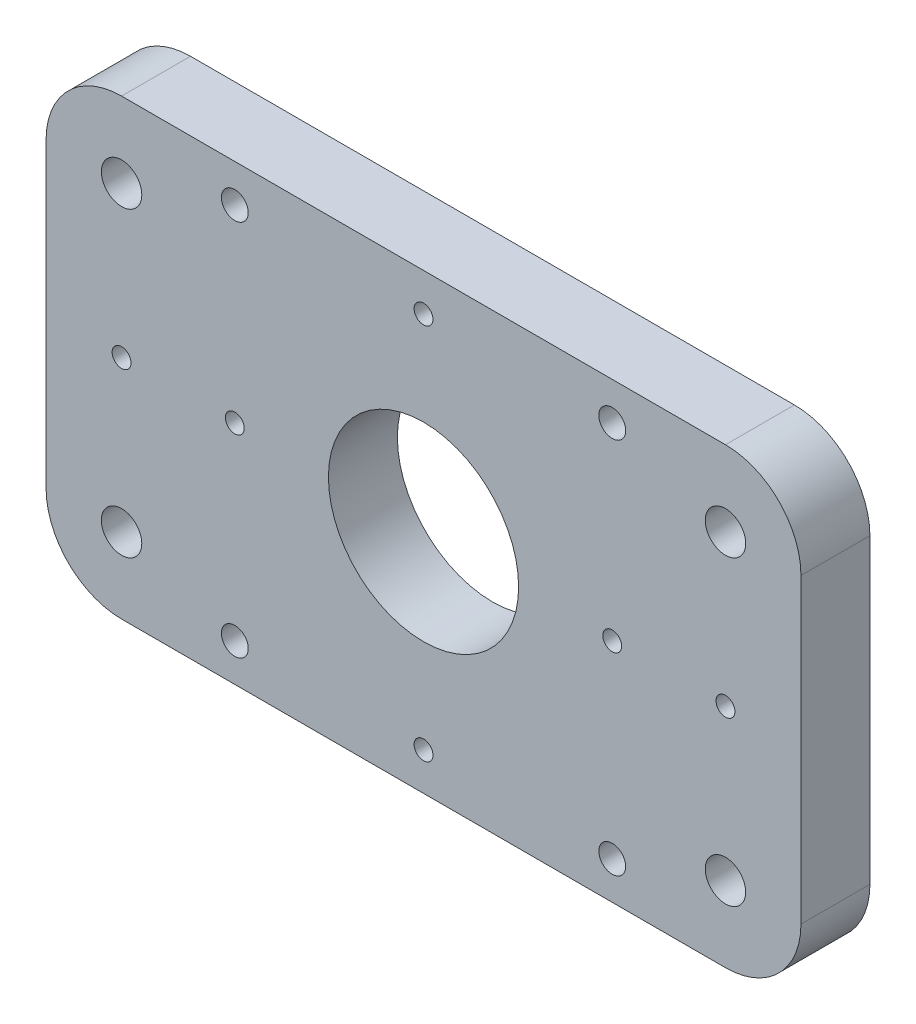
ISO-10303-21;
HEADER;
FILE_DESCRIPTION(('STEP AP214'),'2;1');
FILE_NAME('part.step','',(''),(''),'','','');
FILE_SCHEMA(('AUTOMOTIVE_DESIGN { 1 0 10303 214 1 1 1 1 }'));
ENDSEC;
DATA;
#1=APPLICATION_CONTEXT('core data for automotive mechanical design processes');
#2=APPLICATION_PROTOCOL_DEFINITION('international standard','automotive_design',2000,#1);
#3=PRODUCT_CONTEXT('',#1,'mechanical');
#4=PRODUCT('Part','Part','',(#3));
#5=PRODUCT_RELATED_PRODUCT_CATEGORY('part','',(#4));
#6=PRODUCT_DEFINITION_FORMATION('','',#4);
#7=PRODUCT_DEFINITION_CONTEXT('part definition',#1,'design');
#8=PRODUCT_DEFINITION('design','',#6,#7);
#9=PRODUCT_DEFINITION_SHAPE('','',#8);
#10=(LENGTH_UNIT() NAMED_UNIT(*) SI_UNIT(.MILLI.,.METRE.));
#11=(NAMED_UNIT(*) PLANE_ANGLE_UNIT() SI_UNIT($,.RADIAN.));
#12=(NAMED_UNIT(*) SI_UNIT($,.STERADIAN.) SOLID_ANGLE_UNIT());
#13=UNCERTAINTY_MEASURE_WITH_UNIT(LENGTH_MEASURE(1.E-05),#10,'distance_accuracy_value','');
#14=(GEOMETRIC_REPRESENTATION_CONTEXT(3) GLOBAL_UNCERTAINTY_ASSIGNED_CONTEXT((#13)) GLOBAL_UNIT_ASSIGNED_CONTEXT((#10,
#11,#12)) REPRESENTATION_CONTEXT('',''));
#15=CARTESIAN_POINT('',(0.,0.,0.));
#16=DIRECTION('',(0.,0.,1.));
#17=DIRECTION('',(1.,0.,0.));
#18=AXIS2_PLACEMENT_3D('',#15,#16,#17);
#19=CARTESIAN_POINT('',(0.,38.1,5.8));
#20=DIRECTION('',(0.,-1.,0.));
#21=DIRECTION('',(1.,0.,0.));
#22=AXIS2_PLACEMENT_3D('',#19,#20,#21);
#23=PLANE('',#22);
#24=DIRECTION('',(-1.,0.,0.));
#25=VECTOR('',#24,1.);
#26=CARTESIAN_POINT('',(0.,38.1,0.));
#27=LINE('',#26,#25);
#28=CARTESIAN_POINT('',(6.35,38.1,0.));
#29=VERTEX_POINT('',#28);
#30=CARTESIAN_POINT('',(-44.45,38.1,0.));
#31=VERTEX_POINT('',#30);
#32=EDGE_CURVE('E218',#29,#31,#27,.T.);
#33=ORIENTED_EDGE('',*,*,#32,.T.);
#34=DIRECTION('',(0.,0.,1.));
#35=VECTOR('',#34,1.);
#36=CARTESIAN_POINT('',(-44.45,38.1,5.8));
#37=LINE('',#36,#35);
#38=CARTESIAN_POINT('',(-44.45,38.1,5.8));
#39=VERTEX_POINT('',#38);
#40=EDGE_CURVE('E150',#31,#39,#37,.T.);
#41=ORIENTED_EDGE('',*,*,#40,.T.);
#42=DIRECTION('',(-1.,0.,0.));
#43=VECTOR('',#42,1.);
#44=CARTESIAN_POINT('',(0.,38.1,5.8));
#45=LINE('',#44,#43);
#46=CARTESIAN_POINT('',(6.35,38.1,5.8));
#47=VERTEX_POINT('',#46);
#48=EDGE_CURVE('E102',#47,#39,#45,.T.);
#49=ORIENTED_EDGE('',*,*,#48,.F.);
#50=DIRECTION('',(0.,0.,1.));
#51=VECTOR('',#50,1.);
#52=CARTESIAN_POINT('',(6.35,38.1,0.));
#53=LINE('',#52,#51);
#54=EDGE_CURVE('E148',#47,#29,#53,.F.);
#55=ORIENTED_EDGE('',*,*,#54,.T.);
#56=EDGE_LOOP('',(#33,#41,#49,#55));
#57=FACE_BOUND('',#56,.T.);
#58=ADVANCED_FACE('F32',(#57),#23,.F.);
#59=CARTESIAN_POINT('',(0.,0.,5.8));
#60=DIRECTION('',(0.,1.,0.));
#61=DIRECTION('',(-1.,0.,0.));
#62=AXIS2_PLACEMENT_3D('',#59,#60,#61);
#63=PLANE('',#62);
#64=DIRECTION('',(1.,0.,0.));
#65=VECTOR('',#64,1.);
#66=CARTESIAN_POINT('',(0.,0.,5.8));
#67=LINE('',#66,#65);
#68=CARTESIAN_POINT('',(-44.45,0.,5.8));
#69=VERTEX_POINT('',#68);
#70=CARTESIAN_POINT('',(6.35000000000001,0.,5.8));
#71=VERTEX_POINT('',#70);
#72=EDGE_CURVE('E124',#69,#71,#67,.T.);
#73=ORIENTED_EDGE('',*,*,#72,.F.);
#74=DIRECTION('',(0.,0.,1.));
#75=VECTOR('',#74,1.);
#76=CARTESIAN_POINT('',(-44.45,0.,0.));
#77=LINE('',#76,#75);
#78=CARTESIAN_POINT('',(-44.45,0.,0.));
#79=VERTEX_POINT('',#78);
#80=EDGE_CURVE('E140',#69,#79,#77,.F.);
#81=ORIENTED_EDGE('',*,*,#80,.T.);
#82=DIRECTION('',(1.,0.,0.));
#83=VECTOR('',#82,1.);
#84=CARTESIAN_POINT('',(0.,0.,0.));
#85=LINE('',#84,#83);
#86=CARTESIAN_POINT('',(6.35000000000001,0.,0.));
#87=VERTEX_POINT('',#86);
#88=EDGE_CURVE('E216',#79,#87,#85,.T.);
#89=ORIENTED_EDGE('',*,*,#88,.T.);
#90=DIRECTION('',(0.,0.,1.));
#91=VECTOR('',#90,1.);
#92=CARTESIAN_POINT('',(6.35000000000001,0.,5.8));
#93=LINE('',#92,#91);
#94=EDGE_CURVE('E137',#87,#71,#93,.T.);
#95=ORIENTED_EDGE('',*,*,#94,.T.);
#96=EDGE_LOOP('',(#73,#81,#89,#95));
#97=FACE_BOUND('',#96,.T.);
#98=ADVANCED_FACE('F225',(#97),#63,.F.);
#99=CARTESIAN_POINT('',(0.,38.1,5.8));
#100=DIRECTION('',(0.,0.,1.));
#101=DIRECTION('',(1.,0.,0.));
#102=AXIS2_PLACEMENT_3D('',#99,#100,#101);
#103=PLANE('',#102);
#104=CARTESIAN_POINT('',(-44.45,19.05,5.8));
#105=DIRECTION('',(0.,0.,-1.));
#106=DIRECTION('',(-1.,0.,0.));
#107=AXIS2_PLACEMENT_3D('',#104,#105,#106);
#108=CIRCLE('',#107,0.793749999999999);
#109=CARTESIAN_POINT('',(-45.24375,19.05,5.8));
#110=VERTEX_POINT('',#109);
#111=EDGE_CURVE('E567',#110,#110,#108,.T.);
#112=ORIENTED_EDGE('',*,*,#111,.T.);
#113=EDGE_LOOP('',(#112));
#114=FACE_BOUND('',#113,.T.);
#115=CARTESIAN_POINT('',(6.35000000000001,19.05,5.8));
#116=DIRECTION('',(0.,0.,-1.));
#117=DIRECTION('',(-1.,0.,0.));
#118=AXIS2_PLACEMENT_3D('',#115,#116,#117);
#119=CIRCLE('',#118,0.79375);
#120=CARTESIAN_POINT('',(5.55625000000001,19.05,5.8));
#121=VERTEX_POINT('',#120);
#122=EDGE_CURVE('E563',#121,#121,#119,.T.);
#123=ORIENTED_EDGE('',*,*,#122,.T.);
#124=EDGE_LOOP('',(#123));
#125=FACE_BOUND('',#124,.T.);
#126=CARTESIAN_POINT('',(6.35000000000001,31.75,5.8));
#127=DIRECTION('',(0.,0.,1.));
#128=DIRECTION('',(1.,0.,0.));
#129=AXIS2_PLACEMENT_3D('',#126,#127,#128);
#130=CIRCLE('',#129,1.7);
#131=CARTESIAN_POINT('',(8.05000000000001,31.75,5.8));
#132=VERTEX_POINT('',#131);
#133=EDGE_CURVE('E557',#132,#132,#130,.T.);
#134=ORIENTED_EDGE('',*,*,#133,.F.);
#135=EDGE_LOOP('',(#134));
#136=FACE_BOUND('',#135,.T.);
#137=CARTESIAN_POINT('',(-44.45,31.75,5.8));
#138=DIRECTION('',(0.,0.,1.));
#139=DIRECTION('',(1.,0.,0.));
#140=AXIS2_PLACEMENT_3D('',#137,#138,#139);
#141=CIRCLE('',#140,1.7);
#142=CARTESIAN_POINT('',(-42.75,31.75,5.8));
#143=VERTEX_POINT('',#142);
#144=EDGE_CURVE('E551',#143,#143,#141,.T.);
#145=ORIENTED_EDGE('',*,*,#144,.F.);
#146=EDGE_LOOP('',(#145));
#147=FACE_BOUND('',#146,.T.);
#148=CARTESIAN_POINT('',(-44.45,6.35000000000001,5.8));
#149=DIRECTION('',(0.,0.,1.));
#150=DIRECTION('',(1.,0.,0.));
#151=AXIS2_PLACEMENT_3D('',#148,#149,#150);
#152=CIRCLE('',#151,1.7);
#153=CARTESIAN_POINT('',(-42.75,6.35000000000001,5.8));
#154=VERTEX_POINT('',#153);
#155=EDGE_CURVE('E543',#154,#154,#152,.T.);
#156=ORIENTED_EDGE('',*,*,#155,.F.);
#157=EDGE_LOOP('',(#156));
#158=FACE_BOUND('',#157,.T.);
#159=CARTESIAN_POINT('',(6.35000000000001,6.35,5.8));
#160=DIRECTION('',(0.,0.,1.));
#161=DIRECTION('',(1.,0.,0.));
#162=AXIS2_PLACEMENT_3D('',#159,#160,#161);
#163=CIRCLE('',#162,1.7);
#164=CARTESIAN_POINT('',(8.05000000000001,6.35,5.8));
#165=VERTEX_POINT('',#164);
#166=EDGE_CURVE('E157',#165,#165,#163,.T.);
#167=ORIENTED_EDGE('',*,*,#166,.F.);
#168=EDGE_LOOP('',(#167));
#169=FACE_BOUND('',#168,.T.);
#170=CARTESIAN_POINT('',(-19.05,3.17499999999996,5.8));
#171=DIRECTION('',(0.,0.,1.));
#172=DIRECTION('',(1.,0.,0.));
#173=AXIS2_PLACEMENT_3D('',#170,#171,#172);
#174=CIRCLE('',#173,0.793749999999999);
#175=CARTESIAN_POINT('',(-18.25625,3.17499999999996,5.8));
#176=VERTEX_POINT('',#175);
#177=EDGE_CURVE('E164',#176,#176,#174,.T.);
#178=ORIENTED_EDGE('',*,*,#177,.F.);
#179=EDGE_LOOP('',(#178));
#180=FACE_BOUND('',#179,.T.);
#181=CARTESIAN_POINT('',(-3.17499999999995,19.05,5.8));
#182=DIRECTION('',(0.,0.,1.));
#183=DIRECTION('',(1.,0.,0.));
#184=AXIS2_PLACEMENT_3D('',#181,#182,#183);
#185=CIRCLE('',#184,0.79375);
#186=CARTESIAN_POINT('',(-2.38124999999995,19.05,5.8));
#187=VERTEX_POINT('',#186);
#188=EDGE_CURVE('E169',#187,#187,#185,.T.);
#189=ORIENTED_EDGE('',*,*,#188,.F.);
#190=EDGE_LOOP('',(#189));
#191=FACE_BOUND('',#190,.T.);
#192=CARTESIAN_POINT('',(-19.05,34.925,5.8));
#193=DIRECTION('',(0.,0.,1.));
#194=DIRECTION('',(1.,0.,0.));
#195=AXIS2_PLACEMENT_3D('',#192,#193,#194);
#196=CIRCLE('',#195,0.793749999999999);
#197=CARTESIAN_POINT('',(-18.25625,34.925,5.8));
#198=VERTEX_POINT('',#197);
#199=EDGE_CURVE('E175',#198,#198,#196,.T.);
#200=ORIENTED_EDGE('',*,*,#199,.F.);
#201=EDGE_LOOP('',(#200));
#202=FACE_BOUND('',#201,.T.);
#203=CARTESIAN_POINT('',(-34.925,19.05,5.8));
#204=DIRECTION('',(0.,0.,1.));
#205=DIRECTION('',(1.,0.,0.));
#206=AXIS2_PLACEMENT_3D('',#203,#204,#205);
#207=CIRCLE('',#206,0.793749999999999);
#208=CARTESIAN_POINT('',(-34.13125,19.05,5.8));
#209=VERTEX_POINT('',#208);
#210=EDGE_CURVE('E181',#209,#209,#207,.T.);
#211=ORIENTED_EDGE('',*,*,#210,.F.);
#212=EDGE_LOOP('',(#211));
#213=FACE_BOUND('',#212,.T.);
#214=CARTESIAN_POINT('',(-34.925,3.17499999999997,5.8));
#215=DIRECTION('',(0.,0.,1.));
#216=DIRECTION('',(1.,0.,0.));
#217=AXIS2_PLACEMENT_3D('',#214,#215,#216);
#218=CIRCLE('',#217,1.13);
#219=CARTESIAN_POINT('',(-33.795,3.17499999999997,5.8));
#220=VERTEX_POINT('',#219);
#221=EDGE_CURVE('E187',#220,#220,#218,.T.);
#222=ORIENTED_EDGE('',*,*,#221,.F.);
#223=EDGE_LOOP('',(#222));
#224=FACE_BOUND('',#223,.T.);
#225=CARTESIAN_POINT('',(-3.17499999999997,3.17499999999997,5.8));
#226=DIRECTION('',(0.,0.,1.));
#227=DIRECTION('',(1.,0.,0.));
#228=AXIS2_PLACEMENT_3D('',#225,#226,#227);
#229=CIRCLE('',#228,1.13);
#230=CARTESIAN_POINT('',(-2.04499999999997,3.17499999999997,5.8));
#231=VERTEX_POINT('',#230);
#232=EDGE_CURVE('E193',#231,#231,#229,.T.);
#233=ORIENTED_EDGE('',*,*,#232,.F.);
#234=EDGE_LOOP('',(#233));
#235=FACE_BOUND('',#234,.T.);
#236=CARTESIAN_POINT('',(-3.17499999999997,34.925,5.8));
#237=DIRECTION('',(0.,0.,1.));
#238=DIRECTION('',(1.,0.,0.));
#239=AXIS2_PLACEMENT_3D('',#236,#237,#238);
#240=CIRCLE('',#239,1.13);
#241=CARTESIAN_POINT('',(-2.04499999999997,34.925,5.8));
#242=VERTEX_POINT('',#241);
#243=EDGE_CURVE('E199',#242,#242,#240,.T.);
#244=ORIENTED_EDGE('',*,*,#243,.F.);
#245=EDGE_LOOP('',(#244));
#246=FACE_BOUND('',#245,.T.);
#247=CARTESIAN_POINT('',(-34.925,34.925,5.8));
#248=DIRECTION('',(0.,0.,1.));
#249=DIRECTION('',(1.,0.,0.));
#250=AXIS2_PLACEMENT_3D('',#247,#248,#249);
#251=CIRCLE('',#250,1.13);
#252=CARTESIAN_POINT('',(-33.795,34.925,5.8));
#253=VERTEX_POINT('',#252);
#254=EDGE_CURVE('E205',#253,#253,#251,.T.);
#255=ORIENTED_EDGE('',*,*,#254,.F.);
#256=EDGE_LOOP('',(#255));
#257=FACE_BOUND('',#256,.T.);
#258=CARTESIAN_POINT('',(-19.05,19.05,5.8));
#259=DIRECTION('',(0.,0.,1.));
#260=DIRECTION('',(1.,0.,0.));
#261=AXIS2_PLACEMENT_3D('',#258,#259,#260);
#262=CIRCLE('',#261,8.);
#263=CARTESIAN_POINT('',(-11.05,19.05,5.8));
#264=VERTEX_POINT('',#263);
#265=EDGE_CURVE('E211',#264,#264,#262,.T.);
#266=ORIENTED_EDGE('',*,*,#265,.F.);
#267=EDGE_LOOP('',(#266));
#268=FACE_BOUND('',#267,.T.);
#269=DIRECTION('',(0.,-1.,0.));
#270=VECTOR('',#269,1.);
#271=CARTESIAN_POINT('',(-50.8,38.1,5.8));
#272=LINE('',#271,#270);
#273=CARTESIAN_POINT('',(-50.8,31.75,5.8));
#274=VERTEX_POINT('',#273);
#275=CARTESIAN_POINT('',(-50.8,6.34999999999999,5.8));
#276=VERTEX_POINT('',#275);
#277=EDGE_CURVE('E100',#274,#276,#272,.T.);
#278=ORIENTED_EDGE('',*,*,#277,.T.);
#279=CARTESIAN_POINT('',(-44.45,6.34999999999999,5.8));
#280=DIRECTION('',(0.,0.,1.));
#281=DIRECTION('',(1.,0.,0.));
#282=AXIS2_PLACEMENT_3D('',#279,#280,#281);
#283=CIRCLE('',#282,6.35);
#284=EDGE_CURVE('E107',#276,#69,#283,.T.);
#285=ORIENTED_EDGE('',*,*,#284,.T.);
#286=ORIENTED_EDGE('',*,*,#72,.T.);
#287=CARTESIAN_POINT('',(6.35000000000001,6.35,5.8));
#288=DIRECTION('',(0.,0.,1.));
#289=DIRECTION('',(1.,0.,0.));
#290=AXIS2_PLACEMENT_3D('',#287,#288,#289);
#291=CIRCLE('',#290,6.35);
#292=CARTESIAN_POINT('',(12.7,6.35,5.8));
#293=VERTEX_POINT('',#292);
#294=EDGE_CURVE('E108',#71,#293,#291,.T.);
#295=ORIENTED_EDGE('',*,*,#294,.T.);
#296=DIRECTION('',(0.,1.,0.));
#297=VECTOR('',#296,1.);
#298=CARTESIAN_POINT('',(12.7,38.1,5.8));
#299=LINE('',#298,#297);
#300=CARTESIAN_POINT('',(12.7,31.75,5.8));
#301=VERTEX_POINT('',#300);
#302=EDGE_CURVE('E155',#293,#301,#299,.T.);
#303=ORIENTED_EDGE('',*,*,#302,.T.);
#304=CARTESIAN_POINT('',(6.35000000000001,31.75,5.8));
#305=DIRECTION('',(0.,0.,1.));
#306=DIRECTION('',(1.,0.,0.));
#307=AXIS2_PLACEMENT_3D('',#304,#305,#306);
#308=CIRCLE('',#307,6.35);
#309=EDGE_CURVE('E126',#301,#47,#308,.T.);
#310=ORIENTED_EDGE('',*,*,#309,.T.);
#311=ORIENTED_EDGE('',*,*,#48,.T.);
#312=CARTESIAN_POINT('',(-44.45,31.75,5.8));
#313=DIRECTION('',(0.,0.,1.));
#314=DIRECTION('',(1.,0.,0.));
#315=AXIS2_PLACEMENT_3D('',#312,#313,#314);
#316=CIRCLE('',#315,6.35);
#317=EDGE_CURVE('E97',#39,#274,#316,.T.);
#318=ORIENTED_EDGE('',*,*,#317,.T.);
#319=EDGE_LOOP('',(#278,#285,#286,#295,#303,#310,#311,#318));
#320=FACE_BOUND('',#319,.T.);
#321=ADVANCED_FACE('F99',(#114,#125,#136,#147,#158,#169,#180,#191,#202,#213,#224,#235,#246,#257,
#268,#320),#103,.T.);
#322=CARTESIAN_POINT('',(0.,38.1,0.));
#323=DIRECTION('',(0.,0.,1.));
#324=DIRECTION('',(1.,0.,0.));
#325=AXIS2_PLACEMENT_3D('',#322,#323,#324);
#326=PLANE('',#325);
#327=CARTESIAN_POINT('',(-44.45,19.05,0.));
#328=DIRECTION('',(0.,0.,-1.));
#329=DIRECTION('',(-1.,0.,0.));
#330=AXIS2_PLACEMENT_3D('',#327,#328,#329);
#331=CIRCLE('',#330,0.793749999999999);
#332=CARTESIAN_POINT('',(-45.24375,19.05,0.));
#333=VERTEX_POINT('',#332);
#334=EDGE_CURVE('E570',#333,#333,#331,.T.);
#335=ORIENTED_EDGE('',*,*,#334,.F.);
#336=EDGE_LOOP('',(#335));
#337=FACE_BOUND('',#336,.T.);
#338=CARTESIAN_POINT('',(6.35000000000001,19.05,0.));
#339=DIRECTION('',(0.,0.,-1.));
#340=DIRECTION('',(-1.,0.,0.));
#341=AXIS2_PLACEMENT_3D('',#338,#339,#340);
#342=CIRCLE('',#341,0.79375);
#343=CARTESIAN_POINT('',(5.55625000000001,19.05,0.));
#344=VERTEX_POINT('',#343);
#345=EDGE_CURVE('E564',#344,#344,#342,.T.);
#346=ORIENTED_EDGE('',*,*,#345,.F.);
#347=EDGE_LOOP('',(#346));
#348=FACE_BOUND('',#347,.T.);
#349=CARTESIAN_POINT('',(6.35000000000001,31.75,0.));
#350=DIRECTION('',(0.,0.,-1.));
#351=DIRECTION('',(-1.,0.,0.));
#352=AXIS2_PLACEMENT_3D('',#349,#350,#351);
#353=CIRCLE('',#352,1.7);
#354=CARTESIAN_POINT('',(4.65000000000001,31.75,0.));
#355=VERTEX_POINT('',#354);
#356=EDGE_CURVE('E560',#355,#355,#353,.T.);
#357=ORIENTED_EDGE('',*,*,#356,.F.);
#358=EDGE_LOOP('',(#357));
#359=FACE_BOUND('',#358,.T.);
#360=CARTESIAN_POINT('',(-44.45,31.75,0.));
#361=DIRECTION('',(0.,0.,-1.));
#362=DIRECTION('',(-1.,0.,0.));
#363=AXIS2_PLACEMENT_3D('',#360,#361,#362);
#364=CIRCLE('',#363,1.7);
#365=CARTESIAN_POINT('',(-46.15,31.75,0.));
#366=VERTEX_POINT('',#365);
#367=EDGE_CURVE('E554',#366,#366,#364,.T.);
#368=ORIENTED_EDGE('',*,*,#367,.F.);
#369=EDGE_LOOP('',(#368));
#370=FACE_BOUND('',#369,.T.);
#371=CARTESIAN_POINT('',(-44.45,6.35000000000001,0.));
#372=DIRECTION('',(0.,0.,-1.));
#373=DIRECTION('',(-1.,0.,0.));
#374=AXIS2_PLACEMENT_3D('',#371,#372,#373);
#375=CIRCLE('',#374,1.7);
#376=CARTESIAN_POINT('',(-46.15,6.35000000000001,0.));
#377=VERTEX_POINT('',#376);
#378=EDGE_CURVE('E546',#377,#377,#375,.T.);
#379=ORIENTED_EDGE('',*,*,#378,.F.);
#380=EDGE_LOOP('',(#379));
#381=FACE_BOUND('',#380,.T.);
#382=CARTESIAN_POINT('',(6.35000000000001,6.35,0.));
#383=DIRECTION('',(0.,0.,-1.));
#384=DIRECTION('',(-1.,0.,0.));
#385=AXIS2_PLACEMENT_3D('',#382,#383,#384);
#386=CIRCLE('',#385,1.7);
#387=CARTESIAN_POINT('',(4.65000000000002,6.35,0.));
#388=VERTEX_POINT('',#387);
#389=EDGE_CURVE('E161',#388,#388,#386,.T.);
#390=ORIENTED_EDGE('',*,*,#389,.F.);
#391=EDGE_LOOP('',(#390));
#392=FACE_BOUND('',#391,.T.);
#393=CARTESIAN_POINT('',(-19.05,3.17499999999996,0.));
#394=DIRECTION('',(0.,0.,1.));
#395=DIRECTION('',(1.,0.,0.));
#396=AXIS2_PLACEMENT_3D('',#393,#394,#395);
#397=CIRCLE('',#396,0.793749999999999);
#398=CARTESIAN_POINT('',(-18.25625,3.17499999999996,0.));
#399=VERTEX_POINT('',#398);
#400=EDGE_CURVE('E166',#399,#399,#397,.T.);
#401=ORIENTED_EDGE('',*,*,#400,.T.);
#402=EDGE_LOOP('',(#401));
#403=FACE_BOUND('',#402,.T.);
#404=CARTESIAN_POINT('',(-3.17499999999995,19.05,0.));
#405=DIRECTION('',(0.,0.,1.));
#406=DIRECTION('',(1.,0.,0.));
#407=AXIS2_PLACEMENT_3D('',#404,#405,#406);
#408=CIRCLE('',#407,0.79375);
#409=CARTESIAN_POINT('',(-2.38124999999995,19.05,0.));
#410=VERTEX_POINT('',#409);
#411=EDGE_CURVE('E172',#410,#410,#408,.T.);
#412=ORIENTED_EDGE('',*,*,#411,.T.);
#413=EDGE_LOOP('',(#412));
#414=FACE_BOUND('',#413,.T.);
#415=CARTESIAN_POINT('',(-19.05,34.925,0.));
#416=DIRECTION('',(0.,0.,1.));
#417=DIRECTION('',(1.,0.,0.));
#418=AXIS2_PLACEMENT_3D('',#415,#416,#417);
#419=CIRCLE('',#418,0.793749999999999);
#420=CARTESIAN_POINT('',(-18.25625,34.925,0.));
#421=VERTEX_POINT('',#420);
#422=EDGE_CURVE('E178',#421,#421,#419,.T.);
#423=ORIENTED_EDGE('',*,*,#422,.T.);
#424=EDGE_LOOP('',(#423));
#425=FACE_BOUND('',#424,.T.);
#426=CARTESIAN_POINT('',(-34.925,19.05,0.));
#427=DIRECTION('',(0.,0.,1.));
#428=DIRECTION('',(1.,0.,0.));
#429=AXIS2_PLACEMENT_3D('',#426,#427,#428);
#430=CIRCLE('',#429,0.793749999999999);
#431=CARTESIAN_POINT('',(-34.13125,19.05,0.));
#432=VERTEX_POINT('',#431);
#433=EDGE_CURVE('E184',#432,#432,#430,.T.);
#434=ORIENTED_EDGE('',*,*,#433,.T.);
#435=EDGE_LOOP('',(#434));
#436=FACE_BOUND('',#435,.T.);
#437=CARTESIAN_POINT('',(-34.925,3.17499999999997,0.));
#438=DIRECTION('',(0.,0.,1.));
#439=DIRECTION('',(1.,0.,0.));
#440=AXIS2_PLACEMENT_3D('',#437,#438,#439);
#441=CIRCLE('',#440,1.13);
#442=CARTESIAN_POINT('',(-33.795,3.17499999999997,0.));
#443=VERTEX_POINT('',#442);
#444=EDGE_CURVE('E190',#443,#443,#441,.T.);
#445=ORIENTED_EDGE('',*,*,#444,.T.);
#446=EDGE_LOOP('',(#445));
#447=FACE_BOUND('',#446,.T.);
#448=CARTESIAN_POINT('',(-3.17499999999997,3.17499999999997,0.));
#449=DIRECTION('',(0.,0.,1.));
#450=DIRECTION('',(1.,0.,0.));
#451=AXIS2_PLACEMENT_3D('',#448,#449,#450);
#452=CIRCLE('',#451,1.13);
#453=CARTESIAN_POINT('',(-2.04499999999997,3.17499999999997,0.));
#454=VERTEX_POINT('',#453);
#455=EDGE_CURVE('E196',#454,#454,#452,.T.);
#456=ORIENTED_EDGE('',*,*,#455,.T.);
#457=EDGE_LOOP('',(#456));
#458=FACE_BOUND('',#457,.T.);
#459=CARTESIAN_POINT('',(-3.17499999999997,34.925,0.));
#460=DIRECTION('',(0.,0.,1.));
#461=DIRECTION('',(1.,0.,0.));
#462=AXIS2_PLACEMENT_3D('',#459,#460,#461);
#463=CIRCLE('',#462,1.13);
#464=CARTESIAN_POINT('',(-2.04499999999997,34.925,0.));
#465=VERTEX_POINT('',#464);
#466=EDGE_CURVE('E202',#465,#465,#463,.T.);
#467=ORIENTED_EDGE('',*,*,#466,.T.);
#468=EDGE_LOOP('',(#467));
#469=FACE_BOUND('',#468,.T.);
#470=CARTESIAN_POINT('',(-34.925,34.925,0.));
#471=DIRECTION('',(0.,0.,1.));
#472=DIRECTION('',(1.,0.,0.));
#473=AXIS2_PLACEMENT_3D('',#470,#471,#472);
#474=CIRCLE('',#473,1.13);
#475=CARTESIAN_POINT('',(-33.795,34.925,0.));
#476=VERTEX_POINT('',#475);
#477=EDGE_CURVE('E208',#476,#476,#474,.T.);
#478=ORIENTED_EDGE('',*,*,#477,.T.);
#479=EDGE_LOOP('',(#478));
#480=FACE_BOUND('',#479,.T.);
#481=CARTESIAN_POINT('',(-19.05,19.05,0.));
#482=DIRECTION('',(0.,0.,1.));
#483=DIRECTION('',(1.,0.,0.));
#484=AXIS2_PLACEMENT_3D('',#481,#482,#483);
#485=CIRCLE('',#484,8.);
#486=CARTESIAN_POINT('',(-11.05,19.05,0.));
#487=VERTEX_POINT('',#486);
#488=EDGE_CURVE('E131',#487,#487,#485,.T.);
#489=ORIENTED_EDGE('',*,*,#488,.T.);
#490=EDGE_LOOP('',(#489));
#491=FACE_BOUND('',#490,.T.);
#492=ORIENTED_EDGE('',*,*,#88,.F.);
#493=CARTESIAN_POINT('',(-44.45,6.34999999999999,0.));
#494=DIRECTION('',(0.,0.,1.));
#495=DIRECTION('',(1.,0.,0.));
#496=AXIS2_PLACEMENT_3D('',#493,#494,#495);
#497=CIRCLE('',#496,6.35);
#498=CARTESIAN_POINT('',(-50.8,6.34999999999999,0.));
#499=VERTEX_POINT('',#498);
#500=EDGE_CURVE('E146',#79,#499,#497,.F.);
#501=ORIENTED_EDGE('',*,*,#500,.T.);
#502=DIRECTION('',(0.,-1.,0.));
#503=VECTOR('',#502,1.);
#504=CARTESIAN_POINT('',(-50.8,38.1,0.));
#505=LINE('',#504,#503);
#506=CARTESIAN_POINT('',(-50.8,31.75,0.));
#507=VERTEX_POINT('',#506);
#508=EDGE_CURVE('E118',#507,#499,#505,.T.);
#509=ORIENTED_EDGE('',*,*,#508,.F.);
#510=CARTESIAN_POINT('',(-44.45,31.75,0.));
#511=DIRECTION('',(0.,0.,1.));
#512=DIRECTION('',(1.,0.,0.));
#513=AXIS2_PLACEMENT_3D('',#510,#511,#512);
#514=CIRCLE('',#513,6.35);
#515=EDGE_CURVE('E123',#507,#31,#514,.F.);
#516=ORIENTED_EDGE('',*,*,#515,.T.);
#517=ORIENTED_EDGE('',*,*,#32,.F.);
#518=CARTESIAN_POINT('',(6.35000000000001,31.75,0.));
#519=DIRECTION('',(0.,0.,1.));
#520=DIRECTION('',(1.,0.,0.));
#521=AXIS2_PLACEMENT_3D('',#518,#519,#520);
#522=CIRCLE('',#521,6.35);
#523=CARTESIAN_POINT('',(12.7,31.75,0.));
#524=VERTEX_POINT('',#523);
#525=EDGE_CURVE('E47',#29,#524,#522,.F.);
#526=ORIENTED_EDGE('',*,*,#525,.T.);
#527=DIRECTION('',(0.,1.,0.));
#528=VECTOR('',#527,1.);
#529=CARTESIAN_POINT('',(12.7,38.1,0.));
#530=LINE('',#529,#528);
#531=CARTESIAN_POINT('',(12.7,6.35,0.));
#532=VERTEX_POINT('',#531);
#533=EDGE_CURVE('E119',#532,#524,#530,.T.);
#534=ORIENTED_EDGE('',*,*,#533,.F.);
#535=CARTESIAN_POINT('',(6.35000000000001,6.35,0.));
#536=DIRECTION('',(0.,0.,1.));
#537=DIRECTION('',(1.,0.,0.));
#538=AXIS2_PLACEMENT_3D('',#535,#536,#537);
#539=CIRCLE('',#538,6.35);
#540=EDGE_CURVE('E143',#532,#87,#539,.F.);
#541=ORIENTED_EDGE('',*,*,#540,.T.);
#542=EDGE_LOOP('',(#492,#501,#509,#516,#517,#526,#534,#541));
#543=FACE_BOUND('',#542,.T.);
#544=ADVANCED_FACE('F231',(#337,#348,#359,#370,#381,#392,#403,#414,#425,#436,#447,#458,#469,
#480,#491,#543),#326,.F.);
#545=CARTESIAN_POINT('',(-19.05,19.05,-6.9));
#546=DIRECTION('',(0.,0.,1.));
#547=DIRECTION('',(1.,0.,0.));
#548=AXIS2_PLACEMENT_3D('',#545,#546,#547);
#549=CYLINDRICAL_SURFACE('',#548,8.);
#550=ORIENTED_EDGE('',*,*,#265,.T.);
#551=EDGE_LOOP('',(#550));
#552=FACE_BOUND('',#551,.T.);
#553=ORIENTED_EDGE('',*,*,#488,.F.);
#554=EDGE_LOOP('',(#553));
#555=FACE_BOUND('',#554,.T.);
#556=ADVANCED_FACE('F233',(#552,#555),#549,.F.);
#557=CARTESIAN_POINT('',(-34.925,34.925,0.));
#558=DIRECTION('',(0.,0.,1.));
#559=DIRECTION('',(1.,0.,0.));
#560=AXIS2_PLACEMENT_3D('',#557,#558,#559);
#561=CYLINDRICAL_SURFACE('',#560,1.13);
#562=ORIENTED_EDGE('',*,*,#477,.F.);
#563=EDGE_LOOP('',(#562));
#564=FACE_BOUND('',#563,.T.);
#565=ORIENTED_EDGE('',*,*,#254,.T.);
#566=EDGE_LOOP('',(#565));
#567=FACE_BOUND('',#566,.T.);
#568=ADVANCED_FACE('F240',(#564,#567),#561,.F.);
#569=CARTESIAN_POINT('',(-3.17499999999997,34.925,0.));
#570=DIRECTION('',(0.,0.,1.));
#571=DIRECTION('',(1.,0.,0.));
#572=AXIS2_PLACEMENT_3D('',#569,#570,#571);
#573=CYLINDRICAL_SURFACE('',#572,1.13);
#574=ORIENTED_EDGE('',*,*,#466,.F.);
#575=EDGE_LOOP('',(#574));
#576=FACE_BOUND('',#575,.T.);
#577=ORIENTED_EDGE('',*,*,#243,.T.);
#578=EDGE_LOOP('',(#577));
#579=FACE_BOUND('',#578,.T.);
#580=ADVANCED_FACE('F443',(#576,#579),#573,.F.);
#581=CARTESIAN_POINT('',(-3.17499999999997,3.17499999999997,0.));
#582=DIRECTION('',(0.,0.,1.));
#583=DIRECTION('',(1.,0.,0.));
#584=AXIS2_PLACEMENT_3D('',#581,#582,#583);
#585=CYLINDRICAL_SURFACE('',#584,1.13);
#586=ORIENTED_EDGE('',*,*,#455,.F.);
#587=EDGE_LOOP('',(#586));
#588=FACE_BOUND('',#587,.T.);
#589=ORIENTED_EDGE('',*,*,#232,.T.);
#590=EDGE_LOOP('',(#589));
#591=FACE_BOUND('',#590,.T.);
#592=ADVANCED_FACE('F433',(#588,#591),#585,.F.);
#593=CARTESIAN_POINT('',(-34.925,3.17499999999997,0.));
#594=DIRECTION('',(0.,0.,1.));
#595=DIRECTION('',(1.,0.,0.));
#596=AXIS2_PLACEMENT_3D('',#593,#594,#595);
#597=CYLINDRICAL_SURFACE('',#596,1.13);
#598=ORIENTED_EDGE('',*,*,#444,.F.);
#599=EDGE_LOOP('',(#598));
#600=FACE_BOUND('',#599,.T.);
#601=ORIENTED_EDGE('',*,*,#221,.T.);
#602=EDGE_LOOP('',(#601));
#603=FACE_BOUND('',#602,.T.);
#604=ADVANCED_FACE('F423',(#600,#603),#597,.F.);
#605=CARTESIAN_POINT('',(-34.925,19.05,0.));
#606=DIRECTION('',(0.,0.,1.));
#607=DIRECTION('',(1.,0.,0.));
#608=AXIS2_PLACEMENT_3D('',#605,#606,#607);
#609=CYLINDRICAL_SURFACE('',#608,0.793749999999999);
#610=ORIENTED_EDGE('',*,*,#433,.F.);
#611=EDGE_LOOP('',(#610));
#612=FACE_BOUND('',#611,.T.);
#613=ORIENTED_EDGE('',*,*,#210,.T.);
#614=EDGE_LOOP('',(#613));
#615=FACE_BOUND('',#614,.T.);
#616=ADVANCED_FACE('F413',(#612,#615),#609,.F.);
#617=CARTESIAN_POINT('',(-19.05,34.925,0.));
#618=DIRECTION('',(0.,0.,1.));
#619=DIRECTION('',(1.,0.,0.));
#620=AXIS2_PLACEMENT_3D('',#617,#618,#619);
#621=CYLINDRICAL_SURFACE('',#620,0.793749999999999);
#622=ORIENTED_EDGE('',*,*,#422,.F.);
#623=EDGE_LOOP('',(#622));
#624=FACE_BOUND('',#623,.T.);
#625=ORIENTED_EDGE('',*,*,#199,.T.);
#626=EDGE_LOOP('',(#625));
#627=FACE_BOUND('',#626,.T.);
#628=ADVANCED_FACE('F403',(#624,#627),#621,.F.);
#629=CARTESIAN_POINT('',(-3.17499999999995,19.05,0.));
#630=DIRECTION('',(0.,0.,1.));
#631=DIRECTION('',(1.,0.,0.));
#632=AXIS2_PLACEMENT_3D('',#629,#630,#631);
#633=CYLINDRICAL_SURFACE('',#632,0.79375);
#634=ORIENTED_EDGE('',*,*,#411,.F.);
#635=EDGE_LOOP('',(#634));
#636=FACE_BOUND('',#635,.T.);
#637=ORIENTED_EDGE('',*,*,#188,.T.);
#638=EDGE_LOOP('',(#637));
#639=FACE_BOUND('',#638,.T.);
#640=ADVANCED_FACE('F393',(#636,#639),#633,.F.);
#641=CARTESIAN_POINT('',(-19.05,3.17499999999996,0.));
#642=DIRECTION('',(0.,0.,1.));
#643=DIRECTION('',(1.,0.,0.));
#644=AXIS2_PLACEMENT_3D('',#641,#642,#643);
#645=CYLINDRICAL_SURFACE('',#644,0.793749999999999);
#646=ORIENTED_EDGE('',*,*,#400,.F.);
#647=EDGE_LOOP('',(#646));
#648=FACE_BOUND('',#647,.T.);
#649=ORIENTED_EDGE('',*,*,#177,.T.);
#650=EDGE_LOOP('',(#649));
#651=FACE_BOUND('',#650,.T.);
#652=ADVANCED_FACE('F305',(#648,#651),#645,.F.);
#653=CARTESIAN_POINT('',(-50.8,38.1,0.));
#654=DIRECTION('',(-1.,0.,0.));
#655=DIRECTION('',(0.,-1.,0.));
#656=AXIS2_PLACEMENT_3D('',#653,#654,#655);
#657=PLANE('',#656);
#658=ORIENTED_EDGE('',*,*,#508,.T.);
#659=DIRECTION('',(0.,0.,1.));
#660=VECTOR('',#659,1.);
#661=CARTESIAN_POINT('',(-50.8,6.34999999999999,5.8));
#662=LINE('',#661,#660);
#663=EDGE_CURVE('E117',#499,#276,#662,.T.);
#664=ORIENTED_EDGE('',*,*,#663,.T.);
#665=ORIENTED_EDGE('',*,*,#277,.F.);
#666=DIRECTION('',(0.,0.,1.));
#667=VECTOR('',#666,1.);
#668=CARTESIAN_POINT('',(-50.8,31.75,0.));
#669=LINE('',#668,#667);
#670=EDGE_CURVE('E114',#274,#507,#669,.F.);
#671=ORIENTED_EDGE('',*,*,#670,.T.);
#672=EDGE_LOOP('',(#658,#664,#665,#671));
#673=FACE_BOUND('',#672,.T.);
#674=ADVANCED_FACE('F113',(#673),#657,.T.);
#675=CARTESIAN_POINT('',(12.7,38.1,0.));
#676=DIRECTION('',(1.,0.,0.));
#677=DIRECTION('',(0.,1.,0.));
#678=AXIS2_PLACEMENT_3D('',#675,#676,#677);
#679=PLANE('',#678);
#680=ORIENTED_EDGE('',*,*,#302,.F.);
#681=DIRECTION('',(0.,0.,1.));
#682=VECTOR('',#681,1.);
#683=CARTESIAN_POINT('',(12.7,6.35,0.));
#684=LINE('',#683,#682);
#685=EDGE_CURVE('E11',#293,#532,#684,.F.);
#686=ORIENTED_EDGE('',*,*,#685,.T.);
#687=ORIENTED_EDGE('',*,*,#533,.T.);
#688=DIRECTION('',(0.,0.,1.));
#689=VECTOR('',#688,1.);
#690=CARTESIAN_POINT('',(12.7,31.75,5.8));
#691=LINE('',#690,#689);
#692=EDGE_CURVE('E40',#524,#301,#691,.T.);
#693=ORIENTED_EDGE('',*,*,#692,.T.);
#694=EDGE_LOOP('',(#680,#686,#687,#693));
#695=FACE_BOUND('',#694,.T.);
#696=ADVANCED_FACE('F154',(#695),#679,.T.);
#697=CARTESIAN_POINT('',(6.35000000000001,6.35,0.));
#698=DIRECTION('',(0.,0.,-1.));
#699=DIRECTION('',(-1.,0.,0.));
#700=AXIS2_PLACEMENT_3D('',#697,#698,#699);
#701=CYLINDRICAL_SURFACE('',#700,1.7);
#702=ORIENTED_EDGE('',*,*,#166,.T.);
#703=EDGE_LOOP('',(#702));
#704=FACE_BOUND('',#703,.T.);
#705=ORIENTED_EDGE('',*,*,#389,.T.);
#706=EDGE_LOOP('',(#705));
#707=FACE_BOUND('',#706,.T.);
#708=ADVANCED_FACE('F295',(#704,#707),#701,.F.);
#709=CARTESIAN_POINT('',(-44.45,6.35000000000001,0.));
#710=DIRECTION('',(0.,0.,-1.));
#711=DIRECTION('',(-1.,0.,0.));
#712=AXIS2_PLACEMENT_3D('',#709,#710,#711);
#713=CYLINDRICAL_SURFACE('',#712,1.7);
#714=ORIENTED_EDGE('',*,*,#155,.T.);
#715=EDGE_LOOP('',(#714));
#716=FACE_BOUND('',#715,.T.);
#717=ORIENTED_EDGE('',*,*,#378,.T.);
#718=EDGE_LOOP('',(#717));
#719=FACE_BOUND('',#718,.T.);
#720=ADVANCED_FACE('F368',(#716,#719),#713,.F.);
#721=CARTESIAN_POINT('',(-44.45,31.75,0.));
#722=DIRECTION('',(0.,0.,-1.));
#723=DIRECTION('',(-1.,0.,0.));
#724=AXIS2_PLACEMENT_3D('',#721,#722,#723);
#725=CYLINDRICAL_SURFACE('',#724,1.7);
#726=ORIENTED_EDGE('',*,*,#144,.T.);
#727=EDGE_LOOP('',(#726));
#728=FACE_BOUND('',#727,.T.);
#729=ORIENTED_EDGE('',*,*,#367,.T.);
#730=EDGE_LOOP('',(#729));
#731=FACE_BOUND('',#730,.T.);
#732=ADVANCED_FACE('F358',(#728,#731),#725,.F.);
#733=CARTESIAN_POINT('',(6.35000000000001,31.75,0.));
#734=DIRECTION('',(0.,0.,-1.));
#735=DIRECTION('',(-1.,0.,0.));
#736=AXIS2_PLACEMENT_3D('',#733,#734,#735);
#737=CYLINDRICAL_SURFACE('',#736,1.7);
#738=ORIENTED_EDGE('',*,*,#133,.T.);
#739=EDGE_LOOP('',(#738));
#740=FACE_BOUND('',#739,.T.);
#741=ORIENTED_EDGE('',*,*,#356,.T.);
#742=EDGE_LOOP('',(#741));
#743=FACE_BOUND('',#742,.T.);
#744=ADVANCED_FACE('F348',(#740,#743),#737,.F.);
#745=CARTESIAN_POINT('',(6.35000000000001,19.05,5.8));
#746=DIRECTION('',(0.,0.,-1.));
#747=DIRECTION('',(-1.,0.,0.));
#748=AXIS2_PLACEMENT_3D('',#745,#746,#747);
#749=CYLINDRICAL_SURFACE('',#748,0.79375);
#750=ORIENTED_EDGE('',*,*,#122,.F.);
#751=EDGE_LOOP('',(#750));
#752=FACE_BOUND('',#751,.T.);
#753=ORIENTED_EDGE('',*,*,#345,.T.);
#754=EDGE_LOOP('',(#753));
#755=FACE_BOUND('',#754,.T.);
#756=ADVANCED_FACE('F338',(#752,#755),#749,.F.);
#757=CARTESIAN_POINT('',(-44.45,19.05,5.8));
#758=DIRECTION('',(0.,0.,-1.));
#759=DIRECTION('',(-1.,0.,0.));
#760=AXIS2_PLACEMENT_3D('',#757,#758,#759);
#761=CYLINDRICAL_SURFACE('',#760,0.793749999999999);
#762=ORIENTED_EDGE('',*,*,#111,.F.);
#763=EDGE_LOOP('',(#762));
#764=FACE_BOUND('',#763,.T.);
#765=ORIENTED_EDGE('',*,*,#334,.T.);
#766=EDGE_LOOP('',(#765));
#767=FACE_BOUND('',#766,.T.);
#768=ADVANCED_FACE('F258',(#764,#767),#761,.F.);
#769=CARTESIAN_POINT('',(-44.45,6.34999999999999,0.));
#770=DIRECTION('',(0.,0.,-1.));
#771=DIRECTION('',(-1.,0.,0.));
#772=AXIS2_PLACEMENT_3D('',#769,#770,#771);
#773=CYLINDRICAL_SURFACE('',#772,6.35);
#774=ORIENTED_EDGE('',*,*,#500,.F.);
#775=ORIENTED_EDGE('',*,*,#80,.F.);
#776=ORIENTED_EDGE('',*,*,#284,.F.);
#777=ORIENTED_EDGE('',*,*,#663,.F.);
#778=EDGE_LOOP('',(#774,#775,#776,#777));
#779=FACE_BOUND('',#778,.T.);
#780=ADVANCED_FACE('F255',(#779),#773,.T.);
#781=CARTESIAN_POINT('',(-44.45,31.75,5.8));
#782=DIRECTION('',(0.,0.,-1.));
#783=DIRECTION('',(-1.,0.,0.));
#784=AXIS2_PLACEMENT_3D('',#781,#782,#783);
#785=CYLINDRICAL_SURFACE('',#784,6.35);
#786=ORIENTED_EDGE('',*,*,#515,.F.);
#787=ORIENTED_EDGE('',*,*,#670,.F.);
#788=ORIENTED_EDGE('',*,*,#317,.F.);
#789=ORIENTED_EDGE('',*,*,#40,.F.);
#790=EDGE_LOOP('',(#786,#787,#788,#789));
#791=FACE_BOUND('',#790,.T.);
#792=ADVANCED_FACE('F122',(#791),#785,.T.);
#793=CARTESIAN_POINT('',(6.35000000000001,6.35,5.8));
#794=DIRECTION('',(0.,0.,-1.));
#795=DIRECTION('',(-1.,0.,0.));
#796=AXIS2_PLACEMENT_3D('',#793,#794,#795);
#797=CYLINDRICAL_SURFACE('',#796,6.35);
#798=ORIENTED_EDGE('',*,*,#540,.F.);
#799=ORIENTED_EDGE('',*,*,#685,.F.);
#800=ORIENTED_EDGE('',*,*,#294,.F.);
#801=ORIENTED_EDGE('',*,*,#94,.F.);
#802=EDGE_LOOP('',(#798,#799,#800,#801));
#803=FACE_BOUND('',#802,.T.);
#804=ADVANCED_FACE('F230',(#803),#797,.T.);
#805=CARTESIAN_POINT('',(6.35000000000001,31.75,0.));
#806=DIRECTION('',(0.,0.,-1.));
#807=DIRECTION('',(-1.,0.,0.));
#808=AXIS2_PLACEMENT_3D('',#805,#806,#807);
#809=CYLINDRICAL_SURFACE('',#808,6.35);
#810=ORIENTED_EDGE('',*,*,#525,.F.);
#811=ORIENTED_EDGE('',*,*,#54,.F.);
#812=ORIENTED_EDGE('',*,*,#309,.F.);
#813=ORIENTED_EDGE('',*,*,#692,.F.);
#814=EDGE_LOOP('',(#810,#811,#812,#813));
#815=FACE_BOUND('',#814,.T.);
#816=ADVANCED_FACE('F34',(#815),#809,.T.);
#817=CLOSED_SHELL('',(#58,#98,#321,#544,#556,#568,#580,#592,#604,#616,#628,#640,#652,#674,#696,
#708,#720,#732,#744,#756,#768,#780,#792,#804,#816));
#818=MANIFOLD_SOLID_BREP('B2',#817);
#819=ADVANCED_BREP_SHAPE_REPRESENTATION('',(#18,#818),#14);
#820=SHAPE_DEFINITION_REPRESENTATION(#9,#819);
ENDSEC;
END-ISO-10303-21;
